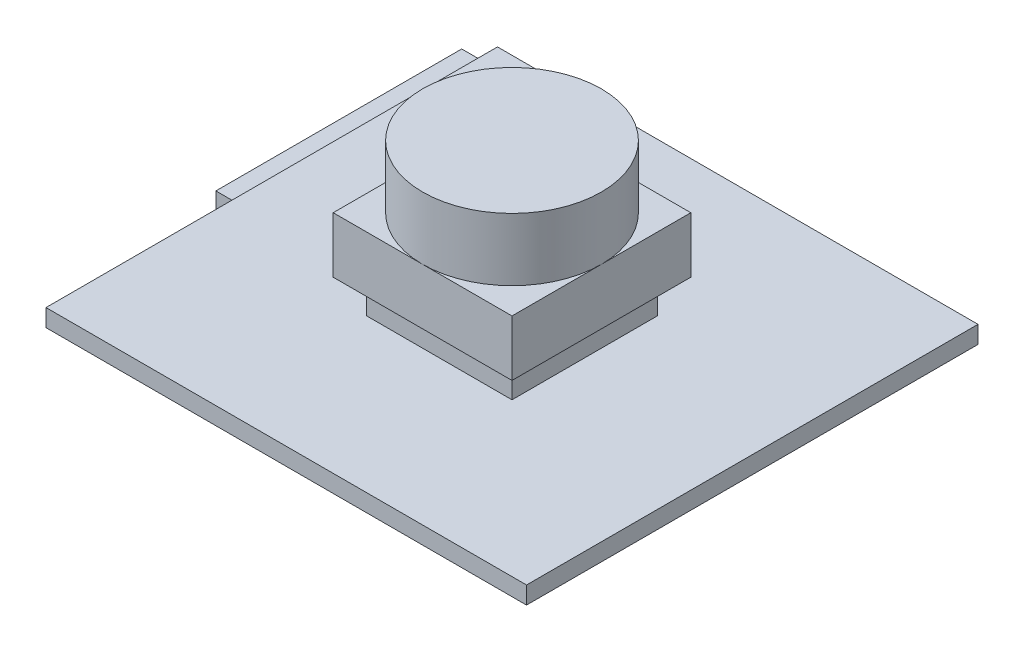
ISO-10303-21;
HEADER;
FILE_DESCRIPTION(('STEP AP214'),'2;1');
FILE_NAME('part.step','',(''),(''),'','','');
FILE_SCHEMA(('AUTOMOTIVE_DESIGN { 1 0 10303 214 1 1 1 1 }'));
ENDSEC;
DATA;
#1=APPLICATION_CONTEXT('core data for automotive mechanical design processes');
#2=APPLICATION_PROTOCOL_DEFINITION('international standard','automotive_design',2000,#1);
#3=PRODUCT_CONTEXT('',#1,'mechanical');
#4=PRODUCT('Part','Part','',(#3));
#5=PRODUCT_RELATED_PRODUCT_CATEGORY('part','',(#4));
#6=PRODUCT_DEFINITION_FORMATION('','',#4);
#7=PRODUCT_DEFINITION_CONTEXT('part definition',#1,'design');
#8=PRODUCT_DEFINITION('design','',#6,#7);
#9=PRODUCT_DEFINITION_SHAPE('','',#8);
#10=(LENGTH_UNIT() NAMED_UNIT(*) SI_UNIT(.MILLI.,.METRE.));
#11=(NAMED_UNIT(*) PLANE_ANGLE_UNIT() SI_UNIT($,.RADIAN.));
#12=(NAMED_UNIT(*) SI_UNIT($,.STERADIAN.) SOLID_ANGLE_UNIT());
#13=UNCERTAINTY_MEASURE_WITH_UNIT(LENGTH_MEASURE(1.E-05),#10,'distance_accuracy_value','');
#14=(GEOMETRIC_REPRESENTATION_CONTEXT(3) GLOBAL_UNCERTAINTY_ASSIGNED_CONTEXT((#13)) GLOBAL_UNIT_ASSIGNED_CONTEXT((#10,
#11,#12)) REPRESENTATION_CONTEXT('',''));
#15=CARTESIAN_POINT('',(0.,0.,0.));
#16=DIRECTION('',(0.,0.,1.));
#17=DIRECTION('',(1.,0.,0.));
#18=AXIS2_PLACEMENT_3D('',#15,#16,#17);
#19=CARTESIAN_POINT('',(0.,4.78,0.));
#20=DIRECTION('',(0.,-1.,0.));
#21=DIRECTION('',(0.,0.,-1.));
#22=AXIS2_PLACEMENT_3D('',#19,#20,#21);
#23=PLANE('',#22);
#24=CARTESIAN_POINT('',(0.,4.78,0.));
#25=DIRECTION('',(0.,1.,0.));
#26=DIRECTION('',(0.,0.,1.));
#27=AXIS2_PLACEMENT_3D('',#24,#25,#26);
#28=CIRCLE('',#27,4.);
#29=CARTESIAN_POINT('',(0.,4.78,4.));
#30=VERTEX_POINT('',#29);
#31=CARTESIAN_POINT('',(4.,4.78,0.));
#32=VERTEX_POINT('',#31);
#33=EDGE_CURVE('E195',#30,#32,#28,.T.);
#34=ORIENTED_EDGE('',*,*,#33,.F.);
#35=DIRECTION('',(1.,0.,0.));
#36=VECTOR('',#35,1.);
#37=CARTESIAN_POINT('',(-4.,4.78,4.));
#38=LINE('',#37,#36);
#39=CARTESIAN_POINT('',(4.,4.78,4.));
#40=VERTEX_POINT('',#39);
#41=EDGE_CURVE('E220',#30,#40,#38,.T.);
#42=ORIENTED_EDGE('',*,*,#41,.T.);
#43=DIRECTION('',(0.,0.,-1.));
#44=VECTOR('',#43,1.);
#45=CARTESIAN_POINT('',(4.,4.78,4.));
#46=LINE('',#45,#44);
#47=EDGE_CURVE('E208',#40,#32,#46,.T.);
#48=ORIENTED_EDGE('',*,*,#47,.T.);
#49=EDGE_LOOP('',(#34,#42,#48));
#50=FACE_BOUND('',#49,.T.);
#51=ADVANCED_FACE('F37',(#50),#23,.F.);
#52=CARTESIAN_POINT('',(0.,4.78,-4.));
#53=VERTEX_POINT('',#52);
#54=EDGE_CURVE('E46',#32,#53,#28,.T.);
#55=ORIENTED_EDGE('',*,*,#54,.F.);
#56=CARTESIAN_POINT('',(4.,4.78,-4.));
#57=VERTEX_POINT('',#56);
#58=EDGE_CURVE('E212',#32,#57,#46,.T.);
#59=ORIENTED_EDGE('',*,*,#58,.T.);
#60=DIRECTION('',(-1.,0.,0.));
#61=VECTOR('',#60,1.);
#62=CARTESIAN_POINT('',(-4.,4.78,-4.));
#63=LINE('',#62,#61);
#64=EDGE_CURVE('E213',#57,#53,#63,.T.);
#65=ORIENTED_EDGE('',*,*,#64,.T.);
#66=EDGE_LOOP('',(#55,#59,#65));
#67=FACE_BOUND('',#66,.T.);
#68=ADVANCED_FACE('F322',(#67),#23,.F.);
#69=CARTESIAN_POINT('',(-4.,4.78,0.));
#70=VERTEX_POINT('',#69);
#71=EDGE_CURVE('E314',#53,#70,#28,.T.);
#72=ORIENTED_EDGE('',*,*,#71,.F.);
#73=CARTESIAN_POINT('',(-4.,4.78,-4.));
#74=VERTEX_POINT('',#73);
#75=EDGE_CURVE('E211',#53,#74,#63,.T.);
#76=ORIENTED_EDGE('',*,*,#75,.T.);
#77=DIRECTION('',(0.,0.,1.));
#78=VECTOR('',#77,1.);
#79=CARTESIAN_POINT('',(-4.,4.78,4.));
#80=LINE('',#79,#78);
#81=EDGE_CURVE('E217',#74,#70,#80,.T.);
#82=ORIENTED_EDGE('',*,*,#81,.T.);
#83=EDGE_LOOP('',(#72,#76,#82));
#84=FACE_BOUND('',#83,.T.);
#85=ADVANCED_FACE('F345',(#84),#23,.F.);
#86=CARTESIAN_POINT('',(0.,0.78,0.));
#87=DIRECTION('',(0.,-1.,0.));
#88=DIRECTION('',(0.,0.,-1.));
#89=AXIS2_PLACEMENT_3D('',#86,#87,#88);
#90=PLANE('',#89);
#91=DIRECTION('',(0.,0.,-1.));
#92=VECTOR('',#91,1.);
#93=CARTESIAN_POINT('',(10.75,0.78,10.1));
#94=LINE('',#93,#92);
#95=CARTESIAN_POINT('',(10.75,0.78,10.1));
#96=VERTEX_POINT('',#95);
#97=CARTESIAN_POINT('',(10.75,0.78,-10.1));
#98=VERTEX_POINT('',#97);
#99=EDGE_CURVE('E280',#96,#98,#94,.T.);
#100=ORIENTED_EDGE('',*,*,#99,.T.);
#101=DIRECTION('',(-1.,0.,0.));
#102=VECTOR('',#101,1.);
#103=CARTESIAN_POINT('',(-10.75,0.78,-10.1));
#104=LINE('',#103,#102);
#105=CARTESIAN_POINT('',(-10.75,0.78,-10.1));
#106=VERTEX_POINT('',#105);
#107=EDGE_CURVE('E283',#98,#106,#104,.T.);
#108=ORIENTED_EDGE('',*,*,#107,.T.);
#109=DIRECTION('',(0.,0.,1.));
#110=VECTOR('',#109,1.);
#111=CARTESIAN_POINT('',(-10.75,0.78,10.1));
#112=LINE('',#111,#110);
#113=CARTESIAN_POINT('',(-10.75,0.78,10.1));
#114=VERTEX_POINT('',#113);
#115=EDGE_CURVE('E286',#106,#114,#112,.T.);
#116=ORIENTED_EDGE('',*,*,#115,.T.);
#117=DIRECTION('',(1.,0.,0.));
#118=VECTOR('',#117,1.);
#119=CARTESIAN_POINT('',(-10.75,0.78,10.1));
#120=LINE('',#119,#118);
#121=EDGE_CURVE('E288',#114,#96,#120,.T.);
#122=ORIENTED_EDGE('',*,*,#121,.T.);
#123=EDGE_LOOP('',(#100,#108,#116,#122));
#124=FACE_BOUND('',#123,.T.);
#125=DIRECTION('',(0.,0.,-1.));
#126=VECTOR('',#125,1.);
#127=CARTESIAN_POINT('',(3.25,0.78,3.25));
#128=LINE('',#127,#126);
#129=CARTESIAN_POINT('',(3.25,0.78,3.25));
#130=VERTEX_POINT('',#129);
#131=CARTESIAN_POINT('',(3.25,0.78,-3.25));
#132=VERTEX_POINT('',#131);
#133=EDGE_CURVE('E243',#130,#132,#128,.T.);
#134=ORIENTED_EDGE('',*,*,#133,.F.);
#135=DIRECTION('',(1.,0.,0.));
#136=VECTOR('',#135,1.);
#137=CARTESIAN_POINT('',(-3.25,0.78,3.25));
#138=LINE('',#137,#136);
#139=CARTESIAN_POINT('',(-3.25,0.78,3.25));
#140=VERTEX_POINT('',#139);
#141=EDGE_CURVE('E248',#140,#130,#138,.T.);
#142=ORIENTED_EDGE('',*,*,#141,.F.);
#143=DIRECTION('',(0.,0.,1.));
#144=VECTOR('',#143,1.);
#145=CARTESIAN_POINT('',(-3.25,0.78,3.25));
#146=LINE('',#145,#144);
#147=CARTESIAN_POINT('',(-3.25,0.78,-3.25));
#148=VERTEX_POINT('',#147);
#149=EDGE_CURVE('E263',#148,#140,#146,.T.);
#150=ORIENTED_EDGE('',*,*,#149,.F.);
#151=DIRECTION('',(-1.,0.,0.));
#152=VECTOR('',#151,1.);
#153=CARTESIAN_POINT('',(-3.25,0.78,-3.25));
#154=LINE('',#153,#152);
#155=EDGE_CURVE('E260',#132,#148,#154,.T.);
#156=ORIENTED_EDGE('',*,*,#155,.F.);
#157=EDGE_LOOP('',(#134,#142,#150,#156));
#158=FACE_BOUND('',#157,.T.);
#159=ADVANCED_FACE('F364',(#124,#158),#90,.F.);
#160=CARTESIAN_POINT('',(10.75,0.78,10.1));
#161=DIRECTION('',(-1.,0.,0.));
#162=DIRECTION('',(0.,0.,1.));
#163=AXIS2_PLACEMENT_3D('',#160,#161,#162);
#164=PLANE('',#163);
#165=DIRECTION('',(0.,0.,-1.));
#166=VECTOR('',#165,1.);
#167=CARTESIAN_POINT('',(10.75,0.,10.1));
#168=LINE('',#167,#166);
#169=CARTESIAN_POINT('',(10.75,0.,10.1));
#170=VERTEX_POINT('',#169);
#171=CARTESIAN_POINT('',(10.75,0.,-10.1));
#172=VERTEX_POINT('',#171);
#173=EDGE_CURVE('E279',#170,#172,#168,.T.);
#174=ORIENTED_EDGE('',*,*,#173,.T.);
#175=DIRECTION('',(0.,-1.,0.));
#176=VECTOR('',#175,1.);
#177=CARTESIAN_POINT('',(10.75,0.78,-10.1));
#178=LINE('',#177,#176);
#179=EDGE_CURVE('E41',#98,#172,#178,.T.);
#180=ORIENTED_EDGE('',*,*,#179,.F.);
#181=ORIENTED_EDGE('',*,*,#99,.F.);
#182=DIRECTION('',(0.,-1.,0.));
#183=VECTOR('',#182,1.);
#184=CARTESIAN_POINT('',(10.75,0.78,10.1));
#185=LINE('',#184,#183);
#186=EDGE_CURVE('E290',#96,#170,#185,.T.);
#187=ORIENTED_EDGE('',*,*,#186,.T.);
#188=EDGE_LOOP('',(#174,#180,#181,#187));
#189=FACE_BOUND('',#188,.T.);
#190=ADVANCED_FACE('F39',(#189),#164,.F.);
#191=CARTESIAN_POINT('',(-10.75,0.78,-10.1));
#192=DIRECTION('',(0.,0.,1.));
#193=DIRECTION('',(1.,0.,0.));
#194=AXIS2_PLACEMENT_3D('',#191,#192,#193);
#195=PLANE('',#194);
#196=DIRECTION('',(-1.,0.,0.));
#197=VECTOR('',#196,1.);
#198=CARTESIAN_POINT('',(-10.75,0.,-10.1));
#199=LINE('',#198,#197);
#200=CARTESIAN_POINT('',(-10.75,0.,-10.1));
#201=VERTEX_POINT('',#200);
#202=EDGE_CURVE('E293',#172,#201,#199,.T.);
#203=ORIENTED_EDGE('',*,*,#202,.T.);
#204=DIRECTION('',(0.,-1.,0.));
#205=VECTOR('',#204,1.);
#206=CARTESIAN_POINT('',(-10.75,0.78,-10.1));
#207=LINE('',#206,#205);
#208=EDGE_CURVE('E304',#106,#201,#207,.T.);
#209=ORIENTED_EDGE('',*,*,#208,.F.);
#210=ORIENTED_EDGE('',*,*,#107,.F.);
#211=ORIENTED_EDGE('',*,*,#179,.T.);
#212=EDGE_LOOP('',(#203,#209,#210,#211));
#213=FACE_BOUND('',#212,.T.);
#214=ADVANCED_FACE('F521',(#213),#195,.F.);
#215=CARTESIAN_POINT('',(-10.75,0.78,10.1));
#216=DIRECTION('',(1.,0.,0.));
#217=DIRECTION('',(0.,0.,-1.));
#218=AXIS2_PLACEMENT_3D('',#215,#216,#217);
#219=PLANE('',#218);
#220=DIRECTION('',(0.,0.,1.));
#221=VECTOR('',#220,1.);
#222=CARTESIAN_POINT('',(-10.75,0.,10.1));
#223=LINE('',#222,#221);
#224=CARTESIAN_POINT('',(-10.75,0.,-10.));
#225=VERTEX_POINT('',#224);
#226=EDGE_CURVE('E295',#201,#225,#223,.T.);
#227=ORIENTED_EDGE('',*,*,#226,.T.);
#228=CARTESIAN_POINT('',(-10.75,0.,1.));
#229=VERTEX_POINT('',#228);
#230=EDGE_CURVE('E298',#225,#229,#223,.T.);
#231=ORIENTED_EDGE('',*,*,#230,.T.);
#232=CARTESIAN_POINT('',(-10.75,0.,10.1));
#233=VERTEX_POINT('',#232);
#234=EDGE_CURVE('E60',#229,#233,#223,.T.);
#235=ORIENTED_EDGE('',*,*,#234,.T.);
#236=DIRECTION('',(0.,-1.,0.));
#237=VECTOR('',#236,1.);
#238=CARTESIAN_POINT('',(-10.75,0.78,10.1));
#239=LINE('',#238,#237);
#240=EDGE_CURVE('E302',#114,#233,#239,.T.);
#241=ORIENTED_EDGE('',*,*,#240,.F.);
#242=ORIENTED_EDGE('',*,*,#115,.F.);
#243=ORIENTED_EDGE('',*,*,#208,.T.);
#244=EDGE_LOOP('',(#227,#231,#235,#241,#242,#243));
#245=FACE_BOUND('',#244,.T.);
#246=ADVANCED_FACE('F512',(#245),#219,.F.);
#247=CARTESIAN_POINT('',(-10.75,0.78,10.1));
#248=DIRECTION('',(0.,0.,-1.));
#249=DIRECTION('',(-1.,0.,0.));
#250=AXIS2_PLACEMENT_3D('',#247,#248,#249);
#251=PLANE('',#250);
#252=DIRECTION('',(1.,0.,0.));
#253=VECTOR('',#252,1.);
#254=CARTESIAN_POINT('',(-10.75,0.,10.1));
#255=LINE('',#254,#253);
#256=EDGE_CURVE('E284',#233,#170,#255,.T.);
#257=ORIENTED_EDGE('',*,*,#256,.T.);
#258=ORIENTED_EDGE('',*,*,#186,.F.);
#259=ORIENTED_EDGE('',*,*,#121,.F.);
#260=ORIENTED_EDGE('',*,*,#240,.T.);
#261=EDGE_LOOP('',(#257,#258,#259,#260));
#262=FACE_BOUND('',#261,.T.);
#263=ADVANCED_FACE('F504',(#262),#251,.F.);
#264=CARTESIAN_POINT('',(0.,0.,0.));
#265=DIRECTION('',(0.,-1.,0.));
#266=DIRECTION('',(0.,0.,-1.));
#267=AXIS2_PLACEMENT_3D('',#264,#265,#266);
#268=PLANE('',#267);
#269=DIRECTION('',(-1.,0.,0.));
#270=VECTOR('',#269,1.);
#271=CARTESIAN_POINT('',(-12.25,0.,1.));
#272=LINE('',#271,#270);
#273=CARTESIAN_POINT('',(3.25,0.,1.));
#274=VERTEX_POINT('',#273);
#275=EDGE_CURVE('E55',#274,#229,#272,.T.);
#276=ORIENTED_EDGE('',*,*,#275,.F.);
#277=DIRECTION('',(0.,0.,1.));
#278=VECTOR('',#277,1.);
#279=CARTESIAN_POINT('',(3.25,0.,-10.));
#280=LINE('',#279,#278);
#281=CARTESIAN_POINT('',(3.25,0.,-10.));
#282=VERTEX_POINT('',#281);
#283=EDGE_CURVE('E585',#282,#274,#280,.T.);
#284=ORIENTED_EDGE('',*,*,#283,.F.);
#285=DIRECTION('',(1.,0.,0.));
#286=VECTOR('',#285,1.);
#287=CARTESIAN_POINT('',(-12.25,0.,-10.));
#288=LINE('',#287,#286);
#289=EDGE_CURVE('E11',#225,#282,#288,.T.);
#290=ORIENTED_EDGE('',*,*,#289,.F.);
#291=ORIENTED_EDGE('',*,*,#226,.F.);
#292=ORIENTED_EDGE('',*,*,#202,.F.);
#293=ORIENTED_EDGE('',*,*,#173,.F.);
#294=ORIENTED_EDGE('',*,*,#256,.F.);
#295=ORIENTED_EDGE('',*,*,#234,.F.);
#296=EDGE_LOOP('',(#276,#284,#290,#291,#292,#293,#294,#295));
#297=FACE_BOUND('',#296,.T.);
#298=ADVANCED_FACE('F496',(#297),#268,.T.);
#299=CARTESIAN_POINT('',(3.25,2.28,3.25));
#300=DIRECTION('',(-1.,0.,0.));
#301=DIRECTION('',(0.,0.,1.));
#302=AXIS2_PLACEMENT_3D('',#299,#300,#301);
#303=PLANE('',#302);
#304=ORIENTED_EDGE('',*,*,#133,.T.);
#305=DIRECTION('',(0.,-1.,0.));
#306=VECTOR('',#305,1.);
#307=CARTESIAN_POINT('',(3.25,2.28,-3.25));
#308=LINE('',#307,#306);
#309=CARTESIAN_POINT('',(3.25,2.28,-3.25));
#310=VERTEX_POINT('',#309);
#311=EDGE_CURVE('E276',#310,#132,#308,.T.);
#312=ORIENTED_EDGE('',*,*,#311,.F.);
#313=DIRECTION('',(0.,0.,-1.));
#314=VECTOR('',#313,1.);
#315=CARTESIAN_POINT('',(3.25,2.28,3.25));
#316=LINE('',#315,#314);
#317=CARTESIAN_POINT('',(3.25,2.28,3.25));
#318=VERTEX_POINT('',#317);
#319=EDGE_CURVE('E244',#318,#310,#316,.T.);
#320=ORIENTED_EDGE('',*,*,#319,.F.);
#321=DIRECTION('',(0.,-1.,0.));
#322=VECTOR('',#321,1.);
#323=CARTESIAN_POINT('',(3.25,2.28,3.25));
#324=LINE('',#323,#322);
#325=EDGE_CURVE('E257',#318,#130,#324,.T.);
#326=ORIENTED_EDGE('',*,*,#325,.T.);
#327=EDGE_LOOP('',(#304,#312,#320,#326));
#328=FACE_BOUND('',#327,.T.);
#329=ADVANCED_FACE('F489',(#328),#303,.F.);
#330=CARTESIAN_POINT('',(-3.25,2.28,-3.25));
#331=DIRECTION('',(0.,0.,1.));
#332=DIRECTION('',(1.,0.,0.));
#333=AXIS2_PLACEMENT_3D('',#330,#331,#332);
#334=PLANE('',#333);
#335=ORIENTED_EDGE('',*,*,#155,.T.);
#336=DIRECTION('',(0.,-1.,0.));
#337=VECTOR('',#336,1.);
#338=CARTESIAN_POINT('',(-3.25,2.28,-3.25));
#339=LINE('',#338,#337);
#340=CARTESIAN_POINT('',(-3.25,2.28,-3.25));
#341=VERTEX_POINT('',#340);
#342=EDGE_CURVE('E273',#341,#148,#339,.T.);
#343=ORIENTED_EDGE('',*,*,#342,.F.);
#344=DIRECTION('',(-1.,0.,0.));
#345=VECTOR('',#344,1.);
#346=CARTESIAN_POINT('',(-3.25,2.28,-3.25));
#347=LINE('',#346,#345);
#348=EDGE_CURVE('E247',#310,#341,#347,.T.);
#349=ORIENTED_EDGE('',*,*,#348,.F.);
#350=ORIENTED_EDGE('',*,*,#311,.T.);
#351=EDGE_LOOP('',(#335,#343,#349,#350));
#352=FACE_BOUND('',#351,.T.);
#353=ADVANCED_FACE('F482',(#352),#334,.F.);
#354=CARTESIAN_POINT('',(-3.25,2.28,3.25));
#355=DIRECTION('',(1.,0.,0.));
#356=DIRECTION('',(0.,0.,-1.));
#357=AXIS2_PLACEMENT_3D('',#354,#355,#356);
#358=PLANE('',#357);
#359=ORIENTED_EDGE('',*,*,#149,.T.);
#360=DIRECTION('',(0.,-1.,0.));
#361=VECTOR('',#360,1.);
#362=CARTESIAN_POINT('',(-3.25,2.28,3.25));
#363=LINE('',#362,#361);
#364=CARTESIAN_POINT('',(-3.25,2.28,3.25));
#365=VERTEX_POINT('',#364);
#366=EDGE_CURVE('E270',#365,#140,#363,.T.);
#367=ORIENTED_EDGE('',*,*,#366,.F.);
#368=DIRECTION('',(0.,0.,1.));
#369=VECTOR('',#368,1.);
#370=CARTESIAN_POINT('',(-3.25,2.28,3.25));
#371=LINE('',#370,#369);
#372=EDGE_CURVE('E251',#341,#365,#371,.T.);
#373=ORIENTED_EDGE('',*,*,#372,.F.);
#374=ORIENTED_EDGE('',*,*,#342,.T.);
#375=EDGE_LOOP('',(#359,#367,#373,#374));
#376=FACE_BOUND('',#375,.T.);
#377=ADVANCED_FACE('F473',(#376),#358,.F.);
#378=CARTESIAN_POINT('',(-3.25,2.28,3.25));
#379=DIRECTION('',(0.,0.,-1.));
#380=DIRECTION('',(-1.,0.,0.));
#381=AXIS2_PLACEMENT_3D('',#378,#379,#380);
#382=PLANE('',#381);
#383=ORIENTED_EDGE('',*,*,#141,.T.);
#384=ORIENTED_EDGE('',*,*,#325,.F.);
#385=DIRECTION('',(1.,0.,0.));
#386=VECTOR('',#385,1.);
#387=CARTESIAN_POINT('',(-3.25,2.28,3.25));
#388=LINE('',#387,#386);
#389=EDGE_CURVE('E254',#365,#318,#388,.T.);
#390=ORIENTED_EDGE('',*,*,#389,.F.);
#391=ORIENTED_EDGE('',*,*,#366,.T.);
#392=EDGE_LOOP('',(#383,#384,#390,#391));
#393=FACE_BOUND('',#392,.T.);
#394=ADVANCED_FACE('F442',(#393),#382,.F.);
#395=CARTESIAN_POINT('',(4.,4.78,4.));
#396=DIRECTION('',(-1.,0.,0.));
#397=DIRECTION('',(0.,0.,1.));
#398=AXIS2_PLACEMENT_3D('',#395,#396,#397);
#399=PLANE('',#398);
#400=DIRECTION('',(0.,0.,-1.));
#401=VECTOR('',#400,1.);
#402=CARTESIAN_POINT('',(4.,2.28,4.));
#403=LINE('',#402,#401);
#404=CARTESIAN_POINT('',(4.,2.28,4.));
#405=VERTEX_POINT('',#404);
#406=CARTESIAN_POINT('',(4.,2.28,-4.));
#407=VERTEX_POINT('',#406);
#408=EDGE_CURVE('E206',#405,#407,#403,.T.);
#409=ORIENTED_EDGE('',*,*,#408,.T.);
#410=DIRECTION('',(0.,-1.,0.));
#411=VECTOR('',#410,1.);
#412=CARTESIAN_POINT('',(4.,4.78,-4.));
#413=LINE('',#412,#411);
#414=EDGE_CURVE('E240',#57,#407,#413,.T.);
#415=ORIENTED_EDGE('',*,*,#414,.F.);
#416=ORIENTED_EDGE('',*,*,#58,.F.);
#417=ORIENTED_EDGE('',*,*,#47,.F.);
#418=DIRECTION('',(0.,-1.,0.));
#419=VECTOR('',#418,1.);
#420=CARTESIAN_POINT('',(4.,4.78,4.));
#421=LINE('',#420,#419);
#422=EDGE_CURVE('E223',#40,#405,#421,.T.);
#423=ORIENTED_EDGE('',*,*,#422,.T.);
#424=EDGE_LOOP('',(#409,#415,#416,#417,#423));
#425=FACE_BOUND('',#424,.T.);
#426=ADVANCED_FACE('F327',(#425),#399,.F.);
#427=CARTESIAN_POINT('',(-4.,4.78,-4.));
#428=DIRECTION('',(0.,0.,1.));
#429=DIRECTION('',(1.,0.,0.));
#430=AXIS2_PLACEMENT_3D('',#427,#428,#429);
#431=PLANE('',#430);
#432=DIRECTION('',(-1.,0.,0.));
#433=VECTOR('',#432,1.);
#434=CARTESIAN_POINT('',(-4.,2.28,-4.));
#435=LINE('',#434,#433);
#436=CARTESIAN_POINT('',(-4.,2.28,-4.));
#437=VERTEX_POINT('',#436);
#438=EDGE_CURVE('E226',#407,#437,#435,.T.);
#439=ORIENTED_EDGE('',*,*,#438,.T.);
#440=DIRECTION('',(0.,-1.,0.));
#441=VECTOR('',#440,1.);
#442=CARTESIAN_POINT('',(-4.,4.78,-4.));
#443=LINE('',#442,#441);
#444=EDGE_CURVE('E237',#74,#437,#443,.T.);
#445=ORIENTED_EDGE('',*,*,#444,.F.);
#446=ORIENTED_EDGE('',*,*,#75,.F.);
#447=ORIENTED_EDGE('',*,*,#64,.F.);
#448=ORIENTED_EDGE('',*,*,#414,.T.);
#449=EDGE_LOOP('',(#439,#445,#446,#447,#448));
#450=FACE_BOUND('',#449,.T.);
#451=ADVANCED_FACE('F341',(#450),#431,.F.);
#452=CARTESIAN_POINT('',(-4.,4.78,4.));
#453=DIRECTION('',(1.,0.,0.));
#454=DIRECTION('',(0.,0.,-1.));
#455=AXIS2_PLACEMENT_3D('',#452,#453,#454);
#456=PLANE('',#455);
#457=DIRECTION('',(0.,0.,1.));
#458=VECTOR('',#457,1.);
#459=CARTESIAN_POINT('',(-4.,2.28,4.));
#460=LINE('',#459,#458);
#461=CARTESIAN_POINT('',(-4.,2.28,4.));
#462=VERTEX_POINT('',#461);
#463=EDGE_CURVE('E228',#437,#462,#460,.T.);
#464=ORIENTED_EDGE('',*,*,#463,.T.);
#465=DIRECTION('',(0.,-1.,0.));
#466=VECTOR('',#465,1.);
#467=CARTESIAN_POINT('',(-4.,4.78,4.));
#468=LINE('',#467,#466);
#469=CARTESIAN_POINT('',(-4.,4.78,4.));
#470=VERTEX_POINT('',#469);
#471=EDGE_CURVE('E234',#470,#462,#468,.T.);
#472=ORIENTED_EDGE('',*,*,#471,.F.);
#473=EDGE_CURVE('E216',#70,#470,#80,.T.);
#474=ORIENTED_EDGE('',*,*,#473,.F.);
#475=ORIENTED_EDGE('',*,*,#81,.F.);
#476=ORIENTED_EDGE('',*,*,#444,.T.);
#477=EDGE_LOOP('',(#464,#472,#474,#475,#476));
#478=FACE_BOUND('',#477,.T.);
#479=ADVANCED_FACE('F348',(#478),#456,.F.);
#480=CARTESIAN_POINT('',(-4.,4.78,4.));
#481=DIRECTION('',(0.,0.,-1.));
#482=DIRECTION('',(-1.,0.,0.));
#483=AXIS2_PLACEMENT_3D('',#480,#481,#482);
#484=PLANE('',#483);
#485=DIRECTION('',(1.,0.,0.));
#486=VECTOR('',#485,1.);
#487=CARTESIAN_POINT('',(-4.,2.28,4.));
#488=LINE('',#487,#486);
#489=EDGE_CURVE('E230',#462,#405,#488,.T.);
#490=ORIENTED_EDGE('',*,*,#489,.T.);
#491=ORIENTED_EDGE('',*,*,#422,.F.);
#492=ORIENTED_EDGE('',*,*,#41,.F.);
#493=EDGE_CURVE('E221',#470,#30,#38,.T.);
#494=ORIENTED_EDGE('',*,*,#493,.F.);
#495=ORIENTED_EDGE('',*,*,#471,.T.);
#496=EDGE_LOOP('',(#490,#491,#492,#494,#495));
#497=FACE_BOUND('',#496,.T.);
#498=ADVANCED_FACE('F333',(#497),#484,.F.);
#499=EDGE_CURVE('E200',#70,#30,#28,.T.);
#500=ORIENTED_EDGE('',*,*,#499,.F.);
#501=ORIENTED_EDGE('',*,*,#473,.T.);
#502=ORIENTED_EDGE('',*,*,#493,.T.);
#503=EDGE_LOOP('',(#500,#501,#502));
#504=FACE_BOUND('',#503,.T.);
#505=ADVANCED_FACE('F351',(#504),#23,.F.);
#506=CARTESIAN_POINT('',(0.,2.28,0.));
#507=DIRECTION('',(0.,-1.,0.));
#508=DIRECTION('',(0.,0.,-1.));
#509=AXIS2_PLACEMENT_3D('',#506,#507,#508);
#510=PLANE('',#509);
#511=ORIENTED_EDGE('',*,*,#389,.T.);
#512=ORIENTED_EDGE('',*,*,#319,.T.);
#513=ORIENTED_EDGE('',*,*,#348,.T.);
#514=ORIENTED_EDGE('',*,*,#372,.T.);
#515=EDGE_LOOP('',(#511,#512,#513,#514));
#516=FACE_BOUND('',#515,.T.);
#517=ORIENTED_EDGE('',*,*,#408,.F.);
#518=ORIENTED_EDGE('',*,*,#489,.F.);
#519=ORIENTED_EDGE('',*,*,#463,.F.);
#520=ORIENTED_EDGE('',*,*,#438,.F.);
#521=EDGE_LOOP('',(#517,#518,#519,#520));
#522=FACE_BOUND('',#521,.T.);
#523=ADVANCED_FACE('F337',(#516,#522),#510,.T.);
#524=CARTESIAN_POINT('',(0.,7.58,0.));
#525=DIRECTION('',(0.,-1.,0.));
#526=DIRECTION('',(0.,0.,-1.));
#527=AXIS2_PLACEMENT_3D('',#524,#525,#526);
#528=CYLINDRICAL_SURFACE('',#527,4.);
#529=CARTESIAN_POINT('',(0.,7.58,0.));
#530=DIRECTION('',(0.,1.,0.));
#531=DIRECTION('',(0.,0.,1.));
#532=AXIS2_PLACEMENT_3D('',#529,#530,#531);
#533=CIRCLE('',#532,4.);
#534=CARTESIAN_POINT('',(0.,7.58,4.));
#535=VERTEX_POINT('',#534);
#536=EDGE_CURVE('E198',#535,#535,#533,.T.);
#537=ORIENTED_EDGE('',*,*,#536,.F.);
#538=EDGE_LOOP('',(#537));
#539=FACE_BOUND('',#538,.T.);
#540=ORIENTED_EDGE('',*,*,#33,.T.);
#541=ORIENTED_EDGE('',*,*,#54,.T.);
#542=ORIENTED_EDGE('',*,*,#71,.T.);
#543=ORIENTED_EDGE('',*,*,#499,.T.);
#544=EDGE_LOOP('',(#540,#541,#542,#543));
#545=FACE_BOUND('',#544,.T.);
#546=ADVANCED_FACE('F318',(#539,#545),#528,.T.);
#547=CARTESIAN_POINT('',(0.,7.58,0.));
#548=DIRECTION('',(0.,1.,0.));
#549=DIRECTION('',(0.,0.,1.));
#550=AXIS2_PLACEMENT_3D('',#547,#548,#549);
#551=PLANE('',#550);
#552=ORIENTED_EDGE('',*,*,#536,.T.);
#553=EDGE_LOOP('',(#552));
#554=FACE_BOUND('',#553,.T.);
#555=ADVANCED_FACE('F394',(#554),#551,.T.);
#556=CARTESIAN_POINT('',(0.,0.,0.));
#557=DIRECTION('',(0.,1.,0.));
#558=DIRECTION('',(0.,0.,1.));
#559=AXIS2_PLACEMENT_3D('',#556,#557,#558);
#560=PLANE('',#559);
#561=ORIENTED_EDGE('',*,*,#230,.F.);
#562=CARTESIAN_POINT('',(-12.25,0.,-10.));
#563=VERTEX_POINT('',#562);
#564=EDGE_CURVE('E48',#563,#225,#288,.T.);
#565=ORIENTED_EDGE('',*,*,#564,.F.);
#566=DIRECTION('',(0.,0.,-1.));
#567=VECTOR('',#566,1.);
#568=CARTESIAN_POINT('',(-12.25,0.,-10.));
#569=LINE('',#568,#567);
#570=CARTESIAN_POINT('',(-12.25,0.,1.));
#571=VERTEX_POINT('',#570);
#572=EDGE_CURVE('E194',#571,#563,#569,.T.);
#573=ORIENTED_EDGE('',*,*,#572,.F.);
#574=EDGE_CURVE('E583',#229,#571,#272,.T.);
#575=ORIENTED_EDGE('',*,*,#574,.F.);
#576=EDGE_LOOP('',(#561,#565,#573,#575));
#577=FACE_BOUND('',#576,.T.);
#578=ADVANCED_FACE('F403',(#577),#560,.T.);
#579=CARTESIAN_POINT('',(-12.25,-2.28,-10.));
#580=DIRECTION('',(1.,0.,0.));
#581=DIRECTION('',(0.,0.,-1.));
#582=AXIS2_PLACEMENT_3D('',#579,#580,#581);
#583=PLANE('',#582);
#584=ORIENTED_EDGE('',*,*,#572,.T.);
#585=DIRECTION('',(0.,1.,0.));
#586=VECTOR('',#585,1.);
#587=CARTESIAN_POINT('',(-12.25,-2.28,-10.));
#588=LINE('',#587,#586);
#589=CARTESIAN_POINT('',(-12.25,-2.28,-10.));
#590=VERTEX_POINT('',#589);
#591=EDGE_CURVE('E175',#590,#563,#588,.T.);
#592=ORIENTED_EDGE('',*,*,#591,.F.);
#593=DIRECTION('',(0.,0.,-1.));
#594=VECTOR('',#593,1.);
#595=CARTESIAN_POINT('',(-12.25,-2.28,-10.));
#596=LINE('',#595,#594);
#597=CARTESIAN_POINT('',(-12.25,-2.28,1.));
#598=VERTEX_POINT('',#597);
#599=EDGE_CURVE('E182',#598,#590,#596,.T.);
#600=ORIENTED_EDGE('',*,*,#599,.F.);
#601=DIRECTION('',(0.,1.,0.));
#602=VECTOR('',#601,1.);
#603=CARTESIAN_POINT('',(-12.25,-2.28,1.));
#604=LINE('',#603,#602);
#605=EDGE_CURVE('E592',#598,#571,#604,.T.);
#606=ORIENTED_EDGE('',*,*,#605,.T.);
#607=EDGE_LOOP('',(#584,#592,#600,#606));
#608=FACE_BOUND('',#607,.T.);
#609=ADVANCED_FACE('F192',(#608),#583,.F.);
#610=CARTESIAN_POINT('',(-12.25,-2.28,-10.));
#611=DIRECTION('',(0.,0.,1.));
#612=DIRECTION('',(1.,0.,0.));
#613=AXIS2_PLACEMENT_3D('',#610,#611,#612);
#614=PLANE('',#613);
#615=ORIENTED_EDGE('',*,*,#564,.T.);
#616=ORIENTED_EDGE('',*,*,#289,.T.);
#617=DIRECTION('',(0.,1.,0.));
#618=VECTOR('',#617,1.);
#619=CARTESIAN_POINT('',(3.25,-2.28,-10.));
#620=LINE('',#619,#618);
#621=CARTESIAN_POINT('',(3.25,-2.28,-10.));
#622=VERTEX_POINT('',#621);
#623=EDGE_CURVE('E178',#622,#282,#620,.T.);
#624=ORIENTED_EDGE('',*,*,#623,.F.);
#625=DIRECTION('',(1.,0.,0.));
#626=VECTOR('',#625,1.);
#627=CARTESIAN_POINT('',(-12.25,-2.28,-10.));
#628=LINE('',#627,#626);
#629=EDGE_CURVE('E170',#590,#622,#628,.T.);
#630=ORIENTED_EDGE('',*,*,#629,.F.);
#631=ORIENTED_EDGE('',*,*,#591,.T.);
#632=EDGE_LOOP('',(#615,#616,#624,#630,#631));
#633=FACE_BOUND('',#632,.T.);
#634=ADVANCED_FACE('F173',(#633),#614,.F.);
#635=CARTESIAN_POINT('',(3.25,-2.28,-10.));
#636=DIRECTION('',(-1.,0.,0.));
#637=DIRECTION('',(0.,0.,1.));
#638=AXIS2_PLACEMENT_3D('',#635,#636,#637);
#639=PLANE('',#638);
#640=ORIENTED_EDGE('',*,*,#283,.T.);
#641=DIRECTION('',(0.,1.,0.));
#642=VECTOR('',#641,1.);
#643=CARTESIAN_POINT('',(3.25,-2.28,1.));
#644=LINE('',#643,#642);
#645=CARTESIAN_POINT('',(3.25,-2.28,1.));
#646=VERTEX_POINT('',#645);
#647=EDGE_CURVE('E201',#646,#274,#644,.T.);
#648=ORIENTED_EDGE('',*,*,#647,.F.);
#649=DIRECTION('',(0.,0.,1.));
#650=VECTOR('',#649,1.);
#651=CARTESIAN_POINT('',(3.25,-2.28,-10.));
#652=LINE('',#651,#650);
#653=EDGE_CURVE('E181',#622,#646,#652,.T.);
#654=ORIENTED_EDGE('',*,*,#653,.F.);
#655=ORIENTED_EDGE('',*,*,#623,.T.);
#656=EDGE_LOOP('',(#640,#648,#654,#655));
#657=FACE_BOUND('',#656,.T.);
#658=ADVANCED_FACE('F597',(#657),#639,.F.);
#659=CARTESIAN_POINT('',(-12.25,-2.28,1.));
#660=DIRECTION('',(0.,0.,-1.));
#661=DIRECTION('',(-1.,0.,0.));
#662=AXIS2_PLACEMENT_3D('',#659,#660,#661);
#663=PLANE('',#662);
#664=ORIENTED_EDGE('',*,*,#275,.T.);
#665=ORIENTED_EDGE('',*,*,#574,.T.);
#666=ORIENTED_EDGE('',*,*,#605,.F.);
#667=DIRECTION('',(-1.,0.,0.));
#668=VECTOR('',#667,1.);
#669=CARTESIAN_POINT('',(-12.25,-2.28,1.));
#670=LINE('',#669,#668);
#671=EDGE_CURVE('E187',#646,#598,#670,.T.);
#672=ORIENTED_EDGE('',*,*,#671,.F.);
#673=ORIENTED_EDGE('',*,*,#647,.T.);
#674=EDGE_LOOP('',(#664,#665,#666,#672,#673));
#675=FACE_BOUND('',#674,.T.);
#676=ADVANCED_FACE('F588',(#675),#663,.F.);
#677=CARTESIAN_POINT('',(0.,-2.28,0.));
#678=DIRECTION('',(0.,1.,0.));
#679=DIRECTION('',(0.,0.,1.));
#680=AXIS2_PLACEMENT_3D('',#677,#678,#679);
#681=PLANE('',#680);
#682=ORIENTED_EDGE('',*,*,#599,.T.);
#683=ORIENTED_EDGE('',*,*,#629,.T.);
#684=ORIENTED_EDGE('',*,*,#653,.T.);
#685=ORIENTED_EDGE('',*,*,#671,.T.);
#686=EDGE_LOOP('',(#682,#683,#684,#685));
#687=FACE_BOUND('',#686,.T.);
#688=ADVANCED_FACE('F185',(#687),#681,.F.);
#689=CLOSED_SHELL('',(#51,#68,#85,#159,#190,#214,#246,#263,#298,#329,#353,#377,#394,#426,#451,
#479,#498,#505,#523,#546,#555,#578,#609,#634,#658,#676,#688));
#690=MANIFOLD_SOLID_BREP('B2',#689);
#691=ADVANCED_BREP_SHAPE_REPRESENTATION('',(#18,#690),#14);
#692=SHAPE_DEFINITION_REPRESENTATION(#9,#691);
ENDSEC;
END-ISO-10303-21;
